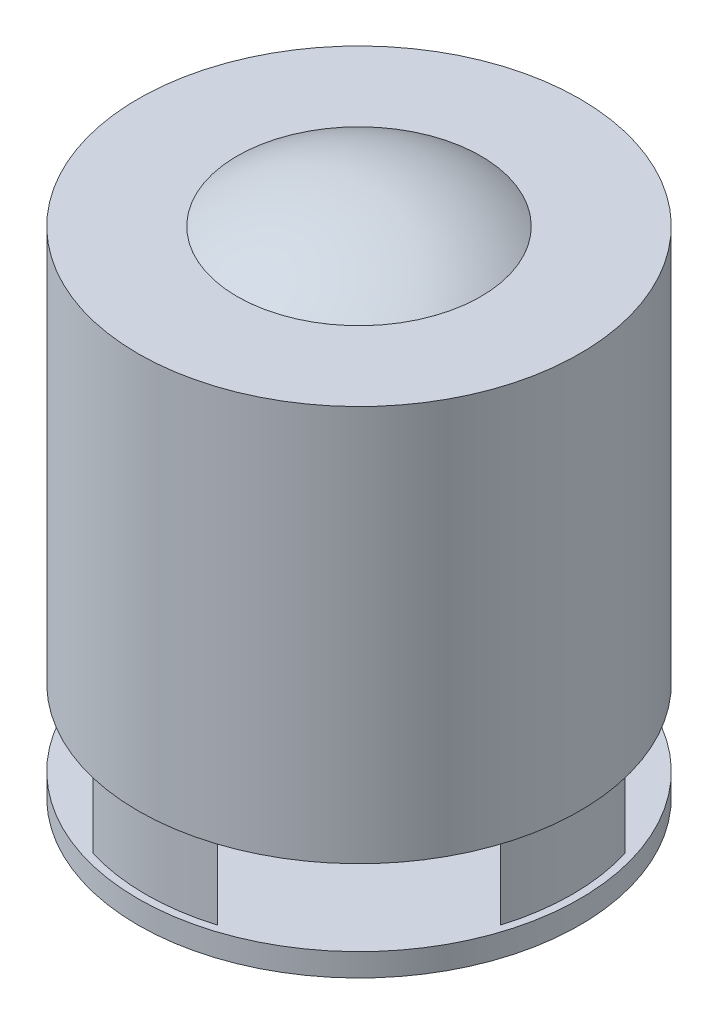
ISO-10303-21;
HEADER;
FILE_DESCRIPTION(('STEP AP214'),'2;1');
FILE_NAME('part.step','',(''),(''),'','','');
FILE_SCHEMA(('AUTOMOTIVE_DESIGN { 1 0 10303 214 1 1 1 1 }'));
ENDSEC;
DATA;
#1=APPLICATION_CONTEXT('core data for automotive mechanical design processes');
#2=APPLICATION_PROTOCOL_DEFINITION('international standard','automotive_design',2000,#1);
#3=PRODUCT_CONTEXT('',#1,'mechanical');
#4=PRODUCT('Part','Part','',(#3));
#5=PRODUCT_RELATED_PRODUCT_CATEGORY('part','',(#4));
#6=PRODUCT_DEFINITION_FORMATION('','',#4);
#7=PRODUCT_DEFINITION_CONTEXT('part definition',#1,'design');
#8=PRODUCT_DEFINITION('design','',#6,#7);
#9=PRODUCT_DEFINITION_SHAPE('','',#8);
#10=(LENGTH_UNIT() NAMED_UNIT(*) SI_UNIT(.MILLI.,.METRE.));
#11=(NAMED_UNIT(*) PLANE_ANGLE_UNIT() SI_UNIT($,.RADIAN.));
#12=(NAMED_UNIT(*) SI_UNIT($,.STERADIAN.) SOLID_ANGLE_UNIT());
#13=UNCERTAINTY_MEASURE_WITH_UNIT(LENGTH_MEASURE(1.E-05),#10,'distance_accuracy_value','');
#14=(GEOMETRIC_REPRESENTATION_CONTEXT(3) GLOBAL_UNCERTAINTY_ASSIGNED_CONTEXT((#13)) GLOBAL_UNIT_ASSIGNED_CONTEXT((#10,
#11,#12)) REPRESENTATION_CONTEXT('',''));
#15=CARTESIAN_POINT('',(0.,0.,0.));
#16=DIRECTION('',(0.,0.,1.));
#17=DIRECTION('',(1.,0.,0.));
#18=AXIS2_PLACEMENT_3D('',#15,#16,#17);
#19=CARTESIAN_POINT('',(0.,0.,0.));
#20=DIRECTION('',(0.,1.,0.));
#21=DIRECTION('',(0.,0.,1.));
#22=AXIS2_PLACEMENT_3D('',#19,#20,#21);
#23=PLANE('',#22);
#24=DIRECTION('',(-0.852221843279124,0.,-0.52318059008141));
#25=VECTOR('',#24,1.);
#26=CARTESIAN_POINT('',(-6.00000000000018,0.,-25.4355));
#27=LINE('',#26,#25);
#28=CARTESIAN_POINT('',(-6.00000000000018,0.,-25.4355));
#29=VERTEX_POINT('',#28);
#30=CARTESIAN_POINT('',(-8.18680124985441,0.,-26.7779813941489));
#31=VERTEX_POINT('',#30);
#32=EDGE_CURVE('E188',#29,#31,#27,.T.);
#33=ORIENTED_EDGE('',*,*,#32,.F.);
#34=DIRECTION('',(-1.,0.,0.));
#35=VECTOR('',#34,1.);
#36=CARTESIAN_POINT('',(5.99999999999982,0.,-25.4355));
#37=LINE('',#36,#35);
#38=CARTESIAN_POINT('',(5.99999999999982,0.,-25.4355));
#39=VERTEX_POINT('',#38);
#40=EDGE_CURVE('E193',#39,#29,#37,.T.);
#41=ORIENTED_EDGE('',*,*,#40,.F.);
#42=DIRECTION('',(-0.852221843279117,0.,0.523180590081421));
#43=VECTOR('',#42,1.);
#44=CARTESIAN_POINT('',(5.99999999999982,0.,-25.4355));
#45=LINE('',#44,#43);
#46=CARTESIAN_POINT('',(8.18680124985403,0.,-26.777981394149));
#47=VERTEX_POINT('',#46);
#48=EDGE_CURVE('E208',#47,#39,#45,.T.);
#49=ORIENTED_EDGE('',*,*,#48,.F.);
#50=CARTESIAN_POINT('',(0.,0.,0.));
#51=DIRECTION('',(0.,-1.,0.));
#52=DIRECTION('',(0.,0.,-1.));
#53=AXIS2_PLACEMENT_3D('',#50,#51,#52);
#54=CIRCLE('',#53,28.0015);
#55=EDGE_CURVE('E205',#31,#47,#54,.T.);
#56=ORIENTED_EDGE('',*,*,#55,.F.);
#57=EDGE_LOOP('',(#33,#41,#49,#56));
#58=FACE_BOUND('',#57,.T.);
#59=DIRECTION('',(0.523180590081413,0.,-0.852221843279122));
#60=VECTOR('',#59,1.);
#61=CARTESIAN_POINT('',(25.4355,0.,-6.00000000000009));
#62=LINE('',#61,#60);
#63=CARTESIAN_POINT('',(25.4355,0.,-6.00000000000009));
#64=VERTEX_POINT('',#63);
#65=CARTESIAN_POINT('',(26.7779813941489,0.,-8.18680124985432));
#66=VERTEX_POINT('',#65);
#67=EDGE_CURVE('E260',#64,#66,#62,.T.);
#68=ORIENTED_EDGE('',*,*,#67,.F.);
#69=DIRECTION('',(0.,0.,-1.));
#70=VECTOR('',#69,1.);
#71=CARTESIAN_POINT('',(25.4355,0.,5.99999999999991));
#72=LINE('',#71,#70);
#73=CARTESIAN_POINT('',(25.4355,0.,5.99999999999991));
#74=VERTEX_POINT('',#73);
#75=EDGE_CURVE('E265',#74,#64,#72,.T.);
#76=ORIENTED_EDGE('',*,*,#75,.F.);
#77=DIRECTION('',(-0.523180590081419,0.,-0.852221843279118));
#78=VECTOR('',#77,1.);
#79=CARTESIAN_POINT('',(25.4355,0.,5.99999999999991));
#80=LINE('',#79,#78);
#81=CARTESIAN_POINT('',(26.7779813941489,0.,8.18680124985413));
#82=VERTEX_POINT('',#81);
#83=EDGE_CURVE('E280',#82,#74,#80,.T.);
#84=ORIENTED_EDGE('',*,*,#83,.F.);
#85=CARTESIAN_POINT('',(0.,0.,0.));
#86=DIRECTION('',(0.,-1.,0.));
#87=DIRECTION('',(0.,0.,-1.));
#88=AXIS2_PLACEMENT_3D('',#85,#86,#87);
#89=CIRCLE('',#88,28.0015);
#90=EDGE_CURVE('E277',#66,#82,#89,.T.);
#91=ORIENTED_EDGE('',*,*,#90,.F.);
#92=EDGE_LOOP('',(#68,#76,#84,#91));
#93=FACE_BOUND('',#92,.T.);
#94=CARTESIAN_POINT('',(0.,0.,0.));
#95=DIRECTION('',(0.,1.,0.));
#96=DIRECTION('',(0.,0.,1.));
#97=AXIS2_PLACEMENT_3D('',#94,#95,#96);
#98=CIRCLE('',#97,29.);
#99=CARTESIAN_POINT('',(0.,0.,-29.));
#100=VERTEX_POINT('',#99);
#101=EDGE_CURVE('E296',#100,#100,#98,.T.);
#102=ORIENTED_EDGE('',*,*,#101,.F.);
#103=EDGE_LOOP('',(#102));
#104=FACE_BOUND('',#103,.T.);
#105=DIRECTION('',(0.85222184327912,0.,0.523180590081416));
#106=VECTOR('',#105,1.);
#107=CARTESIAN_POINT('',(6.,0.,25.4355));
#108=LINE('',#107,#106);
#109=CARTESIAN_POINT('',(6.,0.,25.4355));
#110=VERTEX_POINT('',#109);
#111=CARTESIAN_POINT('',(8.18680124985422,0.,26.7779813941489));
#112=VERTEX_POINT('',#111);
#113=EDGE_CURVE('E224',#110,#112,#108,.T.);
#114=ORIENTED_EDGE('',*,*,#113,.F.);
#115=DIRECTION('',(1.,0.,0.));
#116=VECTOR('',#115,1.);
#117=CARTESIAN_POINT('',(-6.,0.,25.4355));
#118=LINE('',#117,#116);
#119=CARTESIAN_POINT('',(-6.,0.,25.4355));
#120=VERTEX_POINT('',#119);
#121=EDGE_CURVE('E229',#120,#110,#118,.T.);
#122=ORIENTED_EDGE('',*,*,#121,.F.);
#123=DIRECTION('',(0.85222184327912,0.,-0.523180590081416));
#124=VECTOR('',#123,1.);
#125=CARTESIAN_POINT('',(-6.,0.,25.4355));
#126=LINE('',#125,#124);
#127=CARTESIAN_POINT('',(-8.18680124985423,0.,26.7779813941489));
#128=VERTEX_POINT('',#127);
#129=EDGE_CURVE('E244',#128,#120,#126,.T.);
#130=ORIENTED_EDGE('',*,*,#129,.F.);
#131=CARTESIAN_POINT('',(0.,0.,0.));
#132=DIRECTION('',(0.,-1.,0.));
#133=DIRECTION('',(0.,0.,-1.));
#134=AXIS2_PLACEMENT_3D('',#131,#132,#133);
#135=CIRCLE('',#134,28.0015);
#136=EDGE_CURVE('E241',#112,#128,#135,.T.);
#137=ORIENTED_EDGE('',*,*,#136,.F.);
#138=EDGE_LOOP('',(#114,#122,#130,#137));
#139=FACE_BOUND('',#138,.T.);
#140=DIRECTION('',(-0.523180590081406,0.,0.852221843279126));
#141=VECTOR('',#140,1.);
#142=CARTESIAN_POINT('',(-25.4354999999999,0.,6.00000000000026));
#143=LINE('',#142,#141);
#144=CARTESIAN_POINT('',(-25.4354999999999,0.,6.00000000000026));
#145=VERTEX_POINT('',#144);
#146=CARTESIAN_POINT('',(-26.7779813941488,0.,8.18680124985451));
#147=VERTEX_POINT('',#146);
#148=EDGE_CURVE('E177',#145,#147,#143,.T.);
#149=ORIENTED_EDGE('',*,*,#148,.F.);
#150=DIRECTION('',(0.,0.,1.));
#151=VECTOR('',#150,1.);
#152=CARTESIAN_POINT('',(-25.4355000000001,0.,-5.99999999999974));
#153=LINE('',#152,#151);
#154=CARTESIAN_POINT('',(-25.4355000000001,0.,-5.99999999999974));
#155=VERTEX_POINT('',#154);
#156=EDGE_CURVE('E158',#155,#145,#153,.T.);
#157=ORIENTED_EDGE('',*,*,#156,.F.);
#158=DIRECTION('',(0.523180590081425,0.,0.852221843279115));
#159=VECTOR('',#158,1.);
#160=CARTESIAN_POINT('',(-25.4355000000001,0.,-5.99999999999974));
#161=LINE('',#160,#159);
#162=CARTESIAN_POINT('',(-26.777981394149,0.,-8.18680124985394));
#163=VERTEX_POINT('',#162);
#164=EDGE_CURVE('E56',#163,#155,#161,.T.);
#165=ORIENTED_EDGE('',*,*,#164,.F.);
#166=CARTESIAN_POINT('',(0.,0.,0.));
#167=DIRECTION('',(0.,-1.,0.));
#168=DIRECTION('',(0.,0.,-1.));
#169=AXIS2_PLACEMENT_3D('',#166,#167,#168);
#170=CIRCLE('',#169,28.0015);
#171=EDGE_CURVE('E51',#147,#163,#170,.T.);
#172=ORIENTED_EDGE('',*,*,#171,.F.);
#173=EDGE_LOOP('',(#149,#157,#165,#172));
#174=FACE_BOUND('',#173,.T.);
#175=ADVANCED_FACE('F34',(#58,#93,#104,#139,#174),#23,.F.);
#176=CARTESIAN_POINT('',(0.,52.,0.));
#177=DIRECTION('',(0.,-1.,0.));
#178=DIRECTION('',(0.,0.,-1.));
#179=AXIS2_PLACEMENT_3D('',#176,#177,#178);
#180=CYLINDRICAL_SURFACE('',#179,29.);
#181=CARTESIAN_POINT('',(0.,52.,0.));
#182=DIRECTION('',(0.,1.,0.));
#183=DIRECTION('',(0.,0.,1.));
#184=AXIS2_PLACEMENT_3D('',#181,#182,#183);
#185=CIRCLE('',#184,29.);
#186=CARTESIAN_POINT('',(0.,52.,-29.));
#187=VERTEX_POINT('',#186);
#188=EDGE_CURVE('E43',#187,#187,#185,.T.);
#189=CARTESIAN_POINT('',(0.,52.,-29.));
#190=CARTESIAN_POINT('',(0.,51.4583333333333,-29.));
#191=CARTESIAN_POINT('',(0.,50.9166666666667,-29.));
#192=CARTESIAN_POINT('',(0.,49.8333333333333,-29.));
#193=CARTESIAN_POINT('',(0.,49.2916666666667,-29.));
#194=CARTESIAN_POINT('',(0.,48.2083333333333,-29.));
#195=CARTESIAN_POINT('',(0.,47.6666666666667,-29.));
#196=CARTESIAN_POINT('',(0.,46.5833333333333,-29.));
#197=CARTESIAN_POINT('',(0.,46.0416666666667,-29.));
#198=CARTESIAN_POINT('',(0.,44.9583333333333,-29.));
#199=CARTESIAN_POINT('',(0.,44.4166666666667,-29.));
#200=CARTESIAN_POINT('',(0.,43.3333333333333,-29.));
#201=CARTESIAN_POINT('',(0.,42.7916666666667,-29.));
#202=CARTESIAN_POINT('',(0.,41.7083333333333,-29.));
#203=CARTESIAN_POINT('',(0.,41.1666666666667,-29.));
#204=CARTESIAN_POINT('',(0.,40.0833333333333,-29.));
#205=CARTESIAN_POINT('',(0.,39.5416666666667,-29.));
#206=CARTESIAN_POINT('',(0.,38.4583333333333,-29.));
#207=CARTESIAN_POINT('',(0.,37.9166666666667,-29.));
#208=CARTESIAN_POINT('',(0.,36.8333333333333,-29.));
#209=CARTESIAN_POINT('',(0.,36.2916666666667,-29.));
#210=CARTESIAN_POINT('',(0.,35.2083333333333,-29.));
#211=CARTESIAN_POINT('',(0.,34.6666666666667,-29.));
#212=CARTESIAN_POINT('',(0.,33.5833333333333,-29.));
#213=CARTESIAN_POINT('',(0.,33.0416666666667,-29.));
#214=CARTESIAN_POINT('',(0.,31.9583333333333,-29.));
#215=CARTESIAN_POINT('',(0.,31.4166666666667,-29.));
#216=CARTESIAN_POINT('',(0.,30.3333333333333,-29.));
#217=CARTESIAN_POINT('',(0.,29.7916666666667,-29.));
#218=CARTESIAN_POINT('',(0.,28.7083333333333,-29.));
#219=CARTESIAN_POINT('',(0.,28.1666666666667,-29.));
#220=CARTESIAN_POINT('',(0.,27.0833333333333,-29.));
#221=CARTESIAN_POINT('',(0.,26.5416666666667,-29.));
#222=CARTESIAN_POINT('',(0.,25.4583333333333,-29.));
#223=CARTESIAN_POINT('',(0.,24.9166666666667,-29.));
#224=CARTESIAN_POINT('',(0.,23.8333333333333,-29.));
#225=CARTESIAN_POINT('',(0.,23.2916666666667,-29.));
#226=CARTESIAN_POINT('',(0.,22.2083333333333,-29.));
#227=CARTESIAN_POINT('',(0.,21.6666666666667,-29.));
#228=CARTESIAN_POINT('',(0.,20.5833333333333,-29.));
#229=CARTESIAN_POINT('',(0.,20.0416666666667,-29.));
#230=CARTESIAN_POINT('',(0.,18.9583333333333,-29.));
#231=CARTESIAN_POINT('',(0.,18.4166666666667,-29.));
#232=CARTESIAN_POINT('',(0.,17.3333333333333,-29.));
#233=CARTESIAN_POINT('',(0.,16.7916666666667,-29.));
#234=CARTESIAN_POINT('',(0.,15.7083333333333,-29.));
#235=CARTESIAN_POINT('',(0.,15.1666666666667,-29.));
#236=CARTESIAN_POINT('',(0.,14.0833333333333,-29.));
#237=CARTESIAN_POINT('',(0.,13.5416666666667,-29.));
#238=CARTESIAN_POINT('',(0.,12.4583333333333,-29.));
#239=CARTESIAN_POINT('',(0.,11.9166666666667,-29.));
#240=CARTESIAN_POINT('',(0.,10.8333333333333,-29.));
#241=CARTESIAN_POINT('',(0.,10.2916666666667,-29.));
#242=CARTESIAN_POINT('',(0.,9.20833333333333,-29.));
#243=CARTESIAN_POINT('',(0.,8.66666666666667,-29.));
#244=CARTESIAN_POINT('',(0.,7.58333333333333,-29.));
#245=CARTESIAN_POINT('',(0.,7.04166666666667,-29.));
#246=CARTESIAN_POINT('',(0.,5.95833333333333,-29.));
#247=CARTESIAN_POINT('',(0.,5.41666666666667,-29.));
#248=CARTESIAN_POINT('',(0.,4.33333333333333,-29.));
#249=CARTESIAN_POINT('',(0.,3.79166666666667,-29.));
#250=CARTESIAN_POINT('',(0.,2.70833333333334,-29.));
#251=CARTESIAN_POINT('',(0.,2.16666666666667,-29.));
#252=CARTESIAN_POINT('',(0.,1.08333333333333,-29.));
#253=CARTESIAN_POINT('',(0.,0.541666666666667,-29.));
#254=CARTESIAN_POINT('',(0.,0.,-29.));
#255=B_SPLINE_CURVE_WITH_KNOTS('',3,(#189,#190,#191,#192,#193,#194,#195,#196,#197,#198,#199,
#200,#201,#202,#203,#204,#205,#206,#207,#208,#209,#210,#211,#212,#213,#214,#215,#216,#217,#218,
#219,#220,#221,#222,#223,#224,#225,#226,#227,#228,#229,#230,#231,#232,#233,#234,#235,#236,#237,
#238,#239,#240,#241,#242,#243,#244,#245,#246,#247,#248,#249,#250,#251,#252,#253,#254),
.UNSPECIFIED.,.F.,.F.,(4,2,2,2,2,2,2,2,2,2,2,2,2,2,2,2,2,2,2,2,2,2,2,2,2,2,2,2,2,2,2,2,4),(0.,
1.62499999999999,3.25,4.875,6.49999999999999,8.12499999999999,9.74999999999999,11.375,13.,
14.625,16.25,17.875,19.5,21.125,22.75,24.375,26.,27.625,29.25,30.875,32.5,34.125,35.75,37.375,
39.,40.625,42.25,43.875,45.5,47.125,48.75,50.375,52.),.UNSPECIFIED.);
#256=EDGE_CURVE('BSEAM301',#187,#100,#255,.T.);
#257=ORIENTED_EDGE('',*,*,#188,.F.);
#258=ORIENTED_EDGE('',*,*,#101,.T.);
#259=ORIENTED_EDGE('',*,*,#256,.T.);
#260=ORIENTED_EDGE('',*,*,#256,.F.);
#261=EDGE_LOOP('',(#257,#259,#258,#260));
#262=FACE_BOUND('',#261,.T.);
#263=ADVANCED_FACE('F301',(#262),#180,.T.);
#264=CARTESIAN_POINT('',(0.,52.,0.));
#265=DIRECTION('',(0.,1.,0.));
#266=DIRECTION('',(0.,0.,1.));
#267=AXIS2_PLACEMENT_3D('',#264,#265,#266);
#268=PLANE('',#267);
#269=CARTESIAN_POINT('',(0.,52.,0.));
#270=DIRECTION('',(0.,1.,0.));
#271=DIRECTION('',(0.,0.,1.));
#272=AXIS2_PLACEMENT_3D('',#269,#270,#271);
#273=CIRCLE('',#272,16.);
#274=CARTESIAN_POINT('',(0.,52.,16.));
#275=VERTEX_POINT('',#274);
#276=EDGE_CURVE('E11',#275,#275,#273,.T.);
#277=ORIENTED_EDGE('',*,*,#276,.F.);
#278=EDGE_LOOP('',(#277));
#279=FACE_BOUND('',#278,.T.);
#280=ORIENTED_EDGE('',*,*,#188,.T.);
#281=EDGE_LOOP('',(#280));
#282=FACE_BOUND('',#281,.T.);
#283=ADVANCED_FACE('F347',(#279,#282),#268,.T.);
#284=CARTESIAN_POINT('',(25.4355,-10.,-6.00000000000009));
#285=DIRECTION('',(0.852221843279122,0.,0.523180590081413));
#286=DIRECTION('',(0.523180590081413,0.,-0.852221843279122));
#287=AXIS2_PLACEMENT_3D('',#284,#285,#286);
#288=PLANE('',#287);
#289=ORIENTED_EDGE('',*,*,#67,.T.);
#290=DIRECTION('',(0.,1.,0.));
#291=VECTOR('',#290,1.);
#292=CARTESIAN_POINT('',(26.7779813941489,-10.,-8.18680124985432));
#293=LINE('',#292,#291);
#294=CARTESIAN_POINT('',(26.7779813941489,-10.,-8.18680124985432));
#295=VERTEX_POINT('',#294);
#296=EDGE_CURVE('E293',#295,#66,#293,.T.);
#297=ORIENTED_EDGE('',*,*,#296,.F.);
#298=DIRECTION('',(0.523180590081413,0.,-0.852221843279122));
#299=VECTOR('',#298,1.);
#300=CARTESIAN_POINT('',(25.4355,-10.,-6.00000000000009));
#301=LINE('',#300,#299);
#302=CARTESIAN_POINT('',(25.4355,-10.,-6.00000000000009));
#303=VERTEX_POINT('',#302);
#304=EDGE_CURVE('E261',#303,#295,#301,.T.);
#305=ORIENTED_EDGE('',*,*,#304,.F.);
#306=DIRECTION('',(0.,1.,0.));
#307=VECTOR('',#306,1.);
#308=CARTESIAN_POINT('',(25.4355,-10.,-6.00000000000009));
#309=LINE('',#308,#307);
#310=EDGE_CURVE('E274',#303,#64,#309,.T.);
#311=ORIENTED_EDGE('',*,*,#310,.T.);
#312=EDGE_LOOP('',(#289,#297,#305,#311));
#313=FACE_BOUND('',#312,.T.);
#314=ADVANCED_FACE('F350',(#313),#288,.F.);
#315=CARTESIAN_POINT('',(0.,-10.,0.));
#316=DIRECTION('',(0.,1.,0.));
#317=DIRECTION('',(0.,0.,1.));
#318=AXIS2_PLACEMENT_3D('',#315,#316,#317);
#319=CYLINDRICAL_SURFACE('',#318,28.0015);
#320=ORIENTED_EDGE('',*,*,#90,.T.);
#321=DIRECTION('',(0.,1.,0.));
#322=VECTOR('',#321,1.);
#323=CARTESIAN_POINT('',(26.7779813941489,-10.,8.18680124985413));
#324=LINE('',#323,#322);
#325=CARTESIAN_POINT('',(26.7779813941489,-10.,8.18680124985413));
#326=VERTEX_POINT('',#325);
#327=EDGE_CURVE('E290',#326,#82,#324,.T.);
#328=ORIENTED_EDGE('',*,*,#327,.F.);
#329=CARTESIAN_POINT('',(0.,-10.,0.));
#330=DIRECTION('',(0.,-1.,0.));
#331=DIRECTION('',(0.,0.,-1.));
#332=AXIS2_PLACEMENT_3D('',#329,#330,#331);
#333=CIRCLE('',#332,28.0015);
#334=EDGE_CURVE('E264',#295,#326,#333,.T.);
#335=ORIENTED_EDGE('',*,*,#334,.F.);
#336=ORIENTED_EDGE('',*,*,#296,.T.);
#337=EDGE_LOOP('',(#320,#328,#335,#336));
#338=FACE_BOUND('',#337,.T.);
#339=ADVANCED_FACE('F360',(#338),#319,.T.);
#340=CARTESIAN_POINT('',(25.4355,-10.,5.99999999999991));
#341=DIRECTION('',(0.852221843279118,0.,-0.523180590081419));
#342=DIRECTION('',(-0.523180590081419,0.,-0.852221843279119));
#343=AXIS2_PLACEMENT_3D('',#340,#341,#342);
#344=PLANE('',#343);
#345=ORIENTED_EDGE('',*,*,#83,.T.);
#346=DIRECTION('',(0.,1.,0.));
#347=VECTOR('',#346,1.);
#348=CARTESIAN_POINT('',(25.4355,-10.,5.99999999999991));
#349=LINE('',#348,#347);
#350=CARTESIAN_POINT('',(25.4355,-10.,5.99999999999991));
#351=VERTEX_POINT('',#350);
#352=EDGE_CURVE('E287',#351,#74,#349,.T.);
#353=ORIENTED_EDGE('',*,*,#352,.F.);
#354=DIRECTION('',(-0.523180590081419,0.,-0.852221843279118));
#355=VECTOR('',#354,1.);
#356=CARTESIAN_POINT('',(25.4355,-10.,5.99999999999991));
#357=LINE('',#356,#355);
#358=EDGE_CURVE('E268',#326,#351,#357,.T.);
#359=ORIENTED_EDGE('',*,*,#358,.F.);
#360=ORIENTED_EDGE('',*,*,#327,.T.);
#361=EDGE_LOOP('',(#345,#353,#359,#360));
#362=FACE_BOUND('',#361,.T.);
#363=ADVANCED_FACE('F364',(#362),#344,.F.);
#364=CARTESIAN_POINT('',(25.4355,-10.,5.99999999999991));
#365=DIRECTION('',(1.,0.,0.));
#366=DIRECTION('',(0.,0.,-1.));
#367=AXIS2_PLACEMENT_3D('',#364,#365,#366);
#368=PLANE('',#367);
#369=ORIENTED_EDGE('',*,*,#75,.T.);
#370=ORIENTED_EDGE('',*,*,#310,.F.);
#371=DIRECTION('',(0.,0.,-1.));
#372=VECTOR('',#371,1.);
#373=CARTESIAN_POINT('',(25.4355,-10.,5.99999999999991));
#374=LINE('',#373,#372);
#375=EDGE_CURVE('E271',#351,#303,#374,.T.);
#376=ORIENTED_EDGE('',*,*,#375,.F.);
#377=ORIENTED_EDGE('',*,*,#352,.T.);
#378=EDGE_LOOP('',(#369,#370,#376,#377));
#379=FACE_BOUND('',#378,.T.);
#380=ADVANCED_FACE('F368',(#379),#368,.F.);
#381=CARTESIAN_POINT('',(6.,-10.,25.4355));
#382=DIRECTION('',(-0.523180590081416,0.,0.85222184327912));
#383=DIRECTION('',(0.85222184327912,0.,0.523180590081416));
#384=AXIS2_PLACEMENT_3D('',#381,#382,#383);
#385=PLANE('',#384);
#386=ORIENTED_EDGE('',*,*,#113,.T.);
#387=DIRECTION('',(0.,1.,0.));
#388=VECTOR('',#387,1.);
#389=CARTESIAN_POINT('',(8.18680124985422,-10.,26.7779813941489));
#390=LINE('',#389,#388);
#391=CARTESIAN_POINT('',(8.18680124985422,-10.,26.7779813941489));
#392=VERTEX_POINT('',#391);
#393=EDGE_CURVE('E257',#392,#112,#390,.T.);
#394=ORIENTED_EDGE('',*,*,#393,.F.);
#395=DIRECTION('',(0.85222184327912,0.,0.523180590081416));
#396=VECTOR('',#395,1.);
#397=CARTESIAN_POINT('',(6.,-10.,25.4355));
#398=LINE('',#397,#396);
#399=CARTESIAN_POINT('',(6.,-10.,25.4355));
#400=VERTEX_POINT('',#399);
#401=EDGE_CURVE('E225',#400,#392,#398,.T.);
#402=ORIENTED_EDGE('',*,*,#401,.F.);
#403=DIRECTION('',(0.,1.,0.));
#404=VECTOR('',#403,1.);
#405=CARTESIAN_POINT('',(6.,-10.,25.4355));
#406=LINE('',#405,#404);
#407=EDGE_CURVE('E238',#400,#110,#406,.T.);
#408=ORIENTED_EDGE('',*,*,#407,.T.);
#409=EDGE_LOOP('',(#386,#394,#402,#408));
#410=FACE_BOUND('',#409,.T.);
#411=ADVANCED_FACE('F372',(#410),#385,.F.);
#412=CARTESIAN_POINT('',(0.,-10.,0.));
#413=DIRECTION('',(0.,1.,0.));
#414=DIRECTION('',(0.,0.,1.));
#415=AXIS2_PLACEMENT_3D('',#412,#413,#414);
#416=CYLINDRICAL_SURFACE('',#415,28.0015);
#417=ORIENTED_EDGE('',*,*,#136,.T.);
#418=DIRECTION('',(0.,1.,0.));
#419=VECTOR('',#418,1.);
#420=CARTESIAN_POINT('',(-8.18680124985423,-10.,26.7779813941489));
#421=LINE('',#420,#419);
#422=CARTESIAN_POINT('',(-8.18680124985423,-10.,26.7779813941489));
#423=VERTEX_POINT('',#422);
#424=EDGE_CURVE('E254',#423,#128,#421,.T.);
#425=ORIENTED_EDGE('',*,*,#424,.F.);
#426=CARTESIAN_POINT('',(0.,-10.,0.));
#427=DIRECTION('',(0.,-1.,0.));
#428=DIRECTION('',(0.,0.,-1.));
#429=AXIS2_PLACEMENT_3D('',#426,#427,#428);
#430=CIRCLE('',#429,28.0015);
#431=EDGE_CURVE('E228',#392,#423,#430,.T.);
#432=ORIENTED_EDGE('',*,*,#431,.F.);
#433=ORIENTED_EDGE('',*,*,#393,.T.);
#434=EDGE_LOOP('',(#417,#425,#432,#433));
#435=FACE_BOUND('',#434,.T.);
#436=ADVANCED_FACE('F376',(#435),#416,.T.);
#437=CARTESIAN_POINT('',(-6.,-10.,25.4355));
#438=DIRECTION('',(0.523180590081416,0.,0.85222184327912));
#439=DIRECTION('',(0.85222184327912,0.,-0.523180590081416));
#440=AXIS2_PLACEMENT_3D('',#437,#438,#439);
#441=PLANE('',#440);
#442=ORIENTED_EDGE('',*,*,#129,.T.);
#443=DIRECTION('',(0.,1.,0.));
#444=VECTOR('',#443,1.);
#445=CARTESIAN_POINT('',(-6.,-10.,25.4355));
#446=LINE('',#445,#444);
#447=CARTESIAN_POINT('',(-6.,-10.,25.4355));
#448=VERTEX_POINT('',#447);
#449=EDGE_CURVE('E251',#448,#120,#446,.T.);
#450=ORIENTED_EDGE('',*,*,#449,.F.);
#451=DIRECTION('',(0.85222184327912,0.,-0.523180590081416));
#452=VECTOR('',#451,1.);
#453=CARTESIAN_POINT('',(-6.,-10.,25.4355));
#454=LINE('',#453,#452);
#455=EDGE_CURVE('E232',#423,#448,#454,.T.);
#456=ORIENTED_EDGE('',*,*,#455,.F.);
#457=ORIENTED_EDGE('',*,*,#424,.T.);
#458=EDGE_LOOP('',(#442,#450,#456,#457));
#459=FACE_BOUND('',#458,.T.);
#460=ADVANCED_FACE('F380',(#459),#441,.F.);
#461=CARTESIAN_POINT('',(-6.,-10.,25.4355));
#462=DIRECTION('',(0.,0.,1.));
#463=DIRECTION('',(1.,0.,0.));
#464=AXIS2_PLACEMENT_3D('',#461,#462,#463);
#465=PLANE('',#464);
#466=ORIENTED_EDGE('',*,*,#121,.T.);
#467=ORIENTED_EDGE('',*,*,#407,.F.);
#468=DIRECTION('',(1.,0.,0.));
#469=VECTOR('',#468,1.);
#470=CARTESIAN_POINT('',(-6.,-10.,25.4355));
#471=LINE('',#470,#469);
#472=EDGE_CURVE('E235',#448,#400,#471,.T.);
#473=ORIENTED_EDGE('',*,*,#472,.F.);
#474=ORIENTED_EDGE('',*,*,#449,.T.);
#475=EDGE_LOOP('',(#466,#467,#473,#474));
#476=FACE_BOUND('',#475,.T.);
#477=ADVANCED_FACE('F384',(#476),#465,.F.);
#478=CARTESIAN_POINT('',(-6.00000000000018,-10.,-25.4355));
#479=DIRECTION('',(0.52318059008141,0.,-0.852221843279124));
#480=DIRECTION('',(-0.852221843279124,0.,-0.52318059008141));
#481=AXIS2_PLACEMENT_3D('',#478,#479,#480);
#482=PLANE('',#481);
#483=ORIENTED_EDGE('',*,*,#32,.T.);
#484=DIRECTION('',(0.,1.,0.));
#485=VECTOR('',#484,1.);
#486=CARTESIAN_POINT('',(-8.18680124985441,-10.,-26.7779813941489));
#487=LINE('',#486,#485);
#488=CARTESIAN_POINT('',(-8.18680124985441,-10.,-26.7779813941489));
#489=VERTEX_POINT('',#488);
#490=EDGE_CURVE('E221',#489,#31,#487,.T.);
#491=ORIENTED_EDGE('',*,*,#490,.F.);
#492=DIRECTION('',(-0.852221843279124,0.,-0.52318059008141));
#493=VECTOR('',#492,1.);
#494=CARTESIAN_POINT('',(-6.00000000000018,-10.,-25.4355));
#495=LINE('',#494,#493);
#496=CARTESIAN_POINT('',(-6.00000000000018,-10.,-25.4355));
#497=VERTEX_POINT('',#496);
#498=EDGE_CURVE('E189',#497,#489,#495,.T.);
#499=ORIENTED_EDGE('',*,*,#498,.F.);
#500=DIRECTION('',(0.,1.,0.));
#501=VECTOR('',#500,1.);
#502=CARTESIAN_POINT('',(-6.00000000000018,-10.,-25.4355));
#503=LINE('',#502,#501);
#504=EDGE_CURVE('E202',#497,#29,#503,.T.);
#505=ORIENTED_EDGE('',*,*,#504,.T.);
#506=EDGE_LOOP('',(#483,#491,#499,#505));
#507=FACE_BOUND('',#506,.T.);
#508=ADVANCED_FACE('F388',(#507),#482,.F.);
#509=CARTESIAN_POINT('',(0.,-10.,0.));
#510=DIRECTION('',(0.,1.,0.));
#511=DIRECTION('',(0.,0.,1.));
#512=AXIS2_PLACEMENT_3D('',#509,#510,#511);
#513=CYLINDRICAL_SURFACE('',#512,28.0015);
#514=ORIENTED_EDGE('',*,*,#55,.T.);
#515=DIRECTION('',(0.,1.,0.));
#516=VECTOR('',#515,1.);
#517=CARTESIAN_POINT('',(8.18680124985404,-10.,-26.777981394149));
#518=LINE('',#517,#516);
#519=CARTESIAN_POINT('',(8.18680124985404,-10.,-26.777981394149));
#520=VERTEX_POINT('',#519);
#521=EDGE_CURVE('E218',#520,#47,#518,.T.);
#522=ORIENTED_EDGE('',*,*,#521,.F.);
#523=CARTESIAN_POINT('',(0.,-10.,0.));
#524=DIRECTION('',(0.,-1.,0.));
#525=DIRECTION('',(0.,0.,-1.));
#526=AXIS2_PLACEMENT_3D('',#523,#524,#525);
#527=CIRCLE('',#526,28.0015);
#528=EDGE_CURVE('E192',#489,#520,#527,.T.);
#529=ORIENTED_EDGE('',*,*,#528,.F.);
#530=ORIENTED_EDGE('',*,*,#490,.T.);
#531=EDGE_LOOP('',(#514,#522,#529,#530));
#532=FACE_BOUND('',#531,.T.);
#533=ADVANCED_FACE('F392',(#532),#513,.T.);
#534=CARTESIAN_POINT('',(5.99999999999982,-10.,-25.4355));
#535=DIRECTION('',(-0.523180590081422,0.,-0.852221843279117));
#536=DIRECTION('',(-0.852221843279117,0.,0.523180590081422));
#537=AXIS2_PLACEMENT_3D('',#534,#535,#536);
#538=PLANE('',#537);
#539=ORIENTED_EDGE('',*,*,#48,.T.);
#540=DIRECTION('',(0.,1.,0.));
#541=VECTOR('',#540,1.);
#542=CARTESIAN_POINT('',(5.99999999999982,-10.,-25.4355));
#543=LINE('',#542,#541);
#544=CARTESIAN_POINT('',(5.99999999999982,-10.,-25.4355));
#545=VERTEX_POINT('',#544);
#546=EDGE_CURVE('E215',#545,#39,#543,.T.);
#547=ORIENTED_EDGE('',*,*,#546,.F.);
#548=DIRECTION('',(-0.852221843279117,0.,0.523180590081421));
#549=VECTOR('',#548,1.);
#550=CARTESIAN_POINT('',(5.99999999999982,-10.,-25.4355));
#551=LINE('',#550,#549);
#552=EDGE_CURVE('E196',#520,#545,#551,.T.);
#553=ORIENTED_EDGE('',*,*,#552,.F.);
#554=ORIENTED_EDGE('',*,*,#521,.T.);
#555=EDGE_LOOP('',(#539,#547,#553,#554));
#556=FACE_BOUND('',#555,.T.);
#557=ADVANCED_FACE('F396',(#556),#538,.F.);
#558=CARTESIAN_POINT('',(5.99999999999982,-10.,-25.4355));
#559=DIRECTION('',(0.,0.,-1.));
#560=DIRECTION('',(-1.,0.,0.));
#561=AXIS2_PLACEMENT_3D('',#558,#559,#560);
#562=PLANE('',#561);
#563=ORIENTED_EDGE('',*,*,#40,.T.);
#564=ORIENTED_EDGE('',*,*,#504,.F.);
#565=DIRECTION('',(-1.,0.,0.));
#566=VECTOR('',#565,1.);
#567=CARTESIAN_POINT('',(5.99999999999982,-10.,-25.4355));
#568=LINE('',#567,#566);
#569=EDGE_CURVE('E199',#545,#497,#568,.T.);
#570=ORIENTED_EDGE('',*,*,#569,.F.);
#571=ORIENTED_EDGE('',*,*,#546,.T.);
#572=EDGE_LOOP('',(#563,#564,#570,#571));
#573=FACE_BOUND('',#572,.T.);
#574=ADVANCED_FACE('F400',(#573),#562,.F.);
#575=CARTESIAN_POINT('',(-25.4354999999999,-10.,6.00000000000026));
#576=DIRECTION('',(-0.852221843279126,0.,-0.523180590081406));
#577=DIRECTION('',(-0.523180590081406,0.,0.852221843279126));
#578=AXIS2_PLACEMENT_3D('',#575,#576,#577);
#579=PLANE('',#578);
#580=ORIENTED_EDGE('',*,*,#148,.T.);
#581=DIRECTION('',(0.,1.,0.));
#582=VECTOR('',#581,1.);
#583=CARTESIAN_POINT('',(-26.7779813941488,-10.,8.18680124985451));
#584=LINE('',#583,#582);
#585=CARTESIAN_POINT('',(-26.7779813941488,-10.,8.18680124985451));
#586=VERTEX_POINT('',#585);
#587=EDGE_CURVE('E153',#586,#147,#584,.T.);
#588=ORIENTED_EDGE('',*,*,#587,.F.);
#589=DIRECTION('',(-0.523180590081406,0.,0.852221843279126));
#590=VECTOR('',#589,1.);
#591=CARTESIAN_POINT('',(-25.4354999999999,-10.,6.00000000000026));
#592=LINE('',#591,#590);
#593=CARTESIAN_POINT('',(-25.4354999999999,-10.,6.00000000000026));
#594=VERTEX_POINT('',#593);
#595=EDGE_CURVE('E148',#594,#586,#592,.T.);
#596=ORIENTED_EDGE('',*,*,#595,.F.);
#597=DIRECTION('',(0.,1.,0.));
#598=VECTOR('',#597,1.);
#599=CARTESIAN_POINT('',(-25.4354999999999,-10.,6.00000000000026));
#600=LINE('',#599,#598);
#601=EDGE_CURVE('E152',#594,#145,#600,.T.);
#602=ORIENTED_EDGE('',*,*,#601,.T.);
#603=EDGE_LOOP('',(#580,#588,#596,#602));
#604=FACE_BOUND('',#603,.T.);
#605=ADVANCED_FACE('F151',(#604),#579,.F.);
#606=CARTESIAN_POINT('',(0.,-10.,0.));
#607=DIRECTION('',(0.,1.,0.));
#608=DIRECTION('',(0.,0.,1.));
#609=AXIS2_PLACEMENT_3D('',#606,#607,#608);
#610=CYLINDRICAL_SURFACE('',#609,28.0015);
#611=ORIENTED_EDGE('',*,*,#171,.T.);
#612=DIRECTION('',(0.,1.,0.));
#613=VECTOR('',#612,1.);
#614=CARTESIAN_POINT('',(-26.777981394149,-10.,-8.18680124985395));
#615=LINE('',#614,#613);
#616=CARTESIAN_POINT('',(-26.777981394149,-10.,-8.18680124985395));
#617=VERTEX_POINT('',#616);
#618=EDGE_CURVE('E184',#617,#163,#615,.T.);
#619=ORIENTED_EDGE('',*,*,#618,.F.);
#620=CARTESIAN_POINT('',(0.,-10.,0.));
#621=DIRECTION('',(0.,-1.,0.));
#622=DIRECTION('',(0.,0.,-1.));
#623=AXIS2_PLACEMENT_3D('',#620,#621,#622);
#624=CIRCLE('',#623,28.0015);
#625=EDGE_CURVE('E157',#586,#617,#624,.T.);
#626=ORIENTED_EDGE('',*,*,#625,.F.);
#627=ORIENTED_EDGE('',*,*,#587,.T.);
#628=EDGE_LOOP('',(#611,#619,#626,#627));
#629=FACE_BOUND('',#628,.T.);
#630=ADVANCED_FACE('F310',(#629),#610,.T.);
#631=CARTESIAN_POINT('',(-25.4355000000001,-10.,-5.99999999999974));
#632=DIRECTION('',(-0.852221843279115,0.,0.523180590081425));
#633=DIRECTION('',(0.523180590081425,0.,0.852221843279115));
#634=AXIS2_PLACEMENT_3D('',#631,#632,#633);
#635=PLANE('',#634);
#636=ORIENTED_EDGE('',*,*,#164,.T.);
#637=DIRECTION('',(0.,1.,0.));
#638=VECTOR('',#637,1.);
#639=CARTESIAN_POINT('',(-25.4355000000001,-10.,-5.99999999999974));
#640=LINE('',#639,#638);
#641=CARTESIAN_POINT('',(-25.4355000000001,-10.,-5.99999999999974));
#642=VERTEX_POINT('',#641);
#643=EDGE_CURVE('E167',#642,#155,#640,.T.);
#644=ORIENTED_EDGE('',*,*,#643,.F.);
#645=DIRECTION('',(0.523180590081425,0.,0.852221843279115));
#646=VECTOR('',#645,1.);
#647=CARTESIAN_POINT('',(-25.4355000000001,-10.,-5.99999999999974));
#648=LINE('',#647,#646);
#649=EDGE_CURVE('E172',#617,#642,#648,.T.);
#650=ORIENTED_EDGE('',*,*,#649,.F.);
#651=ORIENTED_EDGE('',*,*,#618,.T.);
#652=EDGE_LOOP('',(#636,#644,#650,#651));
#653=FACE_BOUND('',#652,.T.);
#654=ADVANCED_FACE('F308',(#653),#635,.F.);
#655=CARTESIAN_POINT('',(-25.4355000000001,-10.,-5.99999999999974));
#656=DIRECTION('',(-1.,0.,0.));
#657=DIRECTION('',(0.,0.,1.));
#658=AXIS2_PLACEMENT_3D('',#655,#656,#657);
#659=PLANE('',#658);
#660=ORIENTED_EDGE('',*,*,#156,.T.);
#661=ORIENTED_EDGE('',*,*,#601,.F.);
#662=DIRECTION('',(0.,0.,1.));
#663=VECTOR('',#662,1.);
#664=CARTESIAN_POINT('',(-25.4355000000001,-10.,-5.99999999999974));
#665=LINE('',#664,#663);
#666=EDGE_CURVE('E165',#642,#594,#665,.T.);
#667=ORIENTED_EDGE('',*,*,#666,.F.);
#668=ORIENTED_EDGE('',*,*,#643,.T.);
#669=EDGE_LOOP('',(#660,#661,#667,#668));
#670=FACE_BOUND('',#669,.T.);
#671=ADVANCED_FACE('F163',(#670),#659,.F.);
#672=CARTESIAN_POINT('',(0.,-10.,0.));
#673=DIRECTION('',(0.,-1.,0.));
#674=DIRECTION('',(0.,0.,-1.));
#675=AXIS2_PLACEMENT_3D('',#672,#673,#674);
#676=PLANE('',#675);
#677=CARTESIAN_POINT('',(0.,-10.,12.));
#678=DIRECTION('',(0.,-1.,0.));
#679=DIRECTION('',(0.,0.,-1.));
#680=AXIS2_PLACEMENT_3D('',#677,#678,#679);
#681=CIRCLE('',#680,2.05);
#682=CARTESIAN_POINT('',(0.,-10.,9.95));
#683=VERTEX_POINT('',#682);
#684=EDGE_CURVE('E332',#683,#683,#681,.T.);
#685=ORIENTED_EDGE('',*,*,#684,.T.);
#686=EDGE_LOOP('',(#685));
#687=FACE_BOUND('',#686,.T.);
#688=CARTESIAN_POINT('',(10.392304845414,-10.,-5.99999999999956));
#689=DIRECTION('',(0.,-1.,0.));
#690=DIRECTION('',(0.,0.,-1.));
#691=AXIS2_PLACEMENT_3D('',#688,#689,#690);
#692=CIRCLE('',#691,2.05000000000066);
#693=CARTESIAN_POINT('',(10.392304845414,-10.,-8.05000000000022));
#694=VERTEX_POINT('',#693);
#695=EDGE_CURVE('E326',#694,#694,#692,.T.);
#696=ORIENTED_EDGE('',*,*,#695,.T.);
#697=EDGE_LOOP('',(#696));
#698=FACE_BOUND('',#697,.T.);
#699=CARTESIAN_POINT('',(-10.3923048454125,-10.,-6.00000000000045));
#700=DIRECTION('',(0.,-1.,0.));
#701=DIRECTION('',(0.,0.,-1.));
#702=AXIS2_PLACEMENT_3D('',#699,#700,#701);
#703=CIRCLE('',#702,2.05000000000097);
#704=CARTESIAN_POINT('',(-10.3923048454125,-10.,-8.05000000000141));
#705=VERTEX_POINT('',#704);
#706=EDGE_CURVE('E320',#705,#705,#703,.T.);
#707=ORIENTED_EDGE('',*,*,#706,.T.);
#708=EDGE_LOOP('',(#707));
#709=FACE_BOUND('',#708,.T.);
#710=CARTESIAN_POINT('',(0.,-10.,0.));
#711=DIRECTION('',(0.,-1.,0.));
#712=DIRECTION('',(0.,0.,-1.));
#713=AXIS2_PLACEMENT_3D('',#710,#711,#712);
#714=CIRCLE('',#713,29.);
#715=CARTESIAN_POINT('',(0.,-10.,-29.));
#716=VERTEX_POINT('',#715);
#717=EDGE_CURVE('E312',#716,#716,#714,.T.);
#718=ORIENTED_EDGE('',*,*,#717,.F.);
#719=EDGE_LOOP('',(#718));
#720=FACE_BOUND('',#719,.T.);
#721=ORIENTED_EDGE('',*,*,#666,.T.);
#722=ORIENTED_EDGE('',*,*,#595,.T.);
#723=ORIENTED_EDGE('',*,*,#625,.T.);
#724=ORIENTED_EDGE('',*,*,#649,.T.);
#725=EDGE_LOOP('',(#721,#722,#723,#724));
#726=FACE_BOUND('',#725,.T.);
#727=ORIENTED_EDGE('',*,*,#569,.T.);
#728=ORIENTED_EDGE('',*,*,#498,.T.);
#729=ORIENTED_EDGE('',*,*,#528,.T.);
#730=ORIENTED_EDGE('',*,*,#552,.T.);
#731=EDGE_LOOP('',(#727,#728,#729,#730));
#732=FACE_BOUND('',#731,.T.);
#733=ORIENTED_EDGE('',*,*,#472,.T.);
#734=ORIENTED_EDGE('',*,*,#401,.T.);
#735=ORIENTED_EDGE('',*,*,#431,.T.);
#736=ORIENTED_EDGE('',*,*,#455,.T.);
#737=EDGE_LOOP('',(#733,#734,#735,#736));
#738=FACE_BOUND('',#737,.T.);
#739=ORIENTED_EDGE('',*,*,#375,.T.);
#740=ORIENTED_EDGE('',*,*,#304,.T.);
#741=ORIENTED_EDGE('',*,*,#334,.T.);
#742=ORIENTED_EDGE('',*,*,#358,.T.);
#743=EDGE_LOOP('',(#739,#740,#741,#742));
#744=FACE_BOUND('',#743,.T.);
#745=ADVANCED_FACE('F169',(#687,#698,#709,#720,#726,#732,#738,#744),#676,.F.);
#746=CARTESIAN_POINT('',(0.,-13.,0.));
#747=DIRECTION('',(0.,1.,0.));
#748=DIRECTION('',(0.,0.,1.));
#749=AXIS2_PLACEMENT_3D('',#746,#747,#748);
#750=CYLINDRICAL_SURFACE('',#749,29.);
#751=CARTESIAN_POINT('',(0.,-13.,0.));
#752=DIRECTION('',(0.,-1.,0.));
#753=DIRECTION('',(0.,0.,-1.));
#754=AXIS2_PLACEMENT_3D('',#751,#752,#753);
#755=CIRCLE('',#754,29.);
#756=CARTESIAN_POINT('',(0.,-13.,-29.));
#757=VERTEX_POINT('',#756);
#758=EDGE_CURVE('E179',#757,#757,#755,.T.);
#759=ORIENTED_EDGE('',*,*,#758,.F.);
#760=EDGE_LOOP('',(#759));
#761=FACE_BOUND('',#760,.T.);
#762=ORIENTED_EDGE('',*,*,#717,.T.);
#763=EDGE_LOOP('',(#762));
#764=FACE_BOUND('',#763,.T.);
#765=ADVANCED_FACE('F413',(#761,#764),#750,.T.);
#766=CARTESIAN_POINT('',(0.,-13.,0.));
#767=DIRECTION('',(0.,-1.,0.));
#768=DIRECTION('',(0.,0.,-1.));
#769=AXIS2_PLACEMENT_3D('',#766,#767,#768);
#770=PLANE('',#769);
#771=CARTESIAN_POINT('',(0.,-13.,12.));
#772=DIRECTION('',(0.,-1.,0.));
#773=DIRECTION('',(0.,0.,-1.));
#774=AXIS2_PLACEMENT_3D('',#771,#772,#773);
#775=CIRCLE('',#774,2.05);
#776=CARTESIAN_POINT('',(0.,-13.,9.95));
#777=VERTEX_POINT('',#776);
#778=EDGE_CURVE('E329',#777,#777,#775,.T.);
#779=ORIENTED_EDGE('',*,*,#778,.F.);
#780=EDGE_LOOP('',(#779));
#781=FACE_BOUND('',#780,.T.);
#782=CARTESIAN_POINT('',(10.392304845414,-13.,-5.99999999999956));
#783=DIRECTION('',(0.,-1.,0.));
#784=DIRECTION('',(0.,0.,-1.));
#785=AXIS2_PLACEMENT_3D('',#782,#783,#784);
#786=CIRCLE('',#785,2.05000000000066);
#787=CARTESIAN_POINT('',(10.392304845414,-13.,-8.05000000000022));
#788=VERTEX_POINT('',#787);
#789=EDGE_CURVE('E323',#788,#788,#786,.T.);
#790=ORIENTED_EDGE('',*,*,#789,.F.);
#791=EDGE_LOOP('',(#790));
#792=FACE_BOUND('',#791,.T.);
#793=CARTESIAN_POINT('',(-10.3923048454125,-13.,-6.00000000000045));
#794=DIRECTION('',(0.,-1.,0.));
#795=DIRECTION('',(0.,0.,-1.));
#796=AXIS2_PLACEMENT_3D('',#793,#794,#795);
#797=CIRCLE('',#796,2.05000000000097);
#798=CARTESIAN_POINT('',(-10.3923048454125,-13.,-8.05000000000141));
#799=VERTEX_POINT('',#798);
#800=EDGE_CURVE('E317',#799,#799,#797,.T.);
#801=ORIENTED_EDGE('',*,*,#800,.F.);
#802=EDGE_LOOP('',(#801));
#803=FACE_BOUND('',#802,.T.);
#804=ORIENTED_EDGE('',*,*,#758,.T.);
#805=EDGE_LOOP('',(#804));
#806=FACE_BOUND('',#805,.T.);
#807=ADVANCED_FACE('F343',(#781,#792,#803,#806),#770,.T.);
#808=CARTESIAN_POINT('',(0.,52.001,0.));
#809=DIRECTION('',(0.,-1.,0.));
#810=DIRECTION('',(0.,0.,-1.));
#811=AXIS2_PLACEMENT_3D('',#808,#809,#810);
#812=CYLINDRICAL_SURFACE('',#811,16.);
#813=CARTESIAN_POINT('',(0.,52.001,0.));
#814=DIRECTION('',(0.,1.,0.));
#815=DIRECTION('',(0.,0.,1.));
#816=AXIS2_PLACEMENT_3D('',#813,#814,#815);
#817=CIRCLE('',#816,16.);
#818=CARTESIAN_POINT('',(0.,52.001,16.));
#819=VERTEX_POINT('',#818);
#820=EDGE_CURVE('E38',#819,#819,#817,.T.);
#821=ORIENTED_EDGE('',*,*,#820,.F.);
#822=EDGE_LOOP('',(#821));
#823=FACE_BOUND('',#822,.T.);
#824=ORIENTED_EDGE('',*,*,#276,.T.);
#825=EDGE_LOOP('',(#824));
#826=FACE_BOUND('',#825,.T.);
#827=ADVANCED_FACE('F340',(#823,#826),#812,.T.);
#828=CARTESIAN_POINT('',(0.,28.901,0.));
#829=DIRECTION('',(0.,0.,1.));
#830=DIRECTION('',(1.,0.,0.));
#831=AXIS2_PLACEMENT_3D('',#828,#829,#830);
#832=SPHERICAL_SURFACE('',#831,28.1);
#833=CARTESIAN_POINT('',(0.,28.901,0.));
#834=DIRECTION('',(0.,1.,0.));
#835=DIRECTION('',(0.,0.,1.));
#836=AXIS2_PLACEMENT_3D('',#833,#834,#835);
#837=SPHERICAL_SURFACE('',#836,28.1);
#838=ORIENTED_EDGE('',*,*,#820,.T.);
#839=EDGE_LOOP('',(#838));
#840=FACE_BOUND('',#839,.T.);
#841=ADVANCED_FACE('F36',(#840),#837,.T.);
#842=CARTESIAN_POINT('',(-10.3923048454125,-10.,-6.00000000000045));
#843=DIRECTION('',(0.,-1.,0.));
#844=DIRECTION('',(0.,0.,-1.));
#845=AXIS2_PLACEMENT_3D('',#842,#843,#844);
#846=CYLINDRICAL_SURFACE('',#845,2.05000000000097);
#847=ORIENTED_EDGE('',*,*,#706,.F.);
#848=EDGE_LOOP('',(#847));
#849=FACE_BOUND('',#848,.T.);
#850=ORIENTED_EDGE('',*,*,#800,.T.);
#851=EDGE_LOOP('',(#850));
#852=FACE_BOUND('',#851,.T.);
#853=ADVANCED_FACE('F422',(#849,#852),#846,.F.);
#854=CARTESIAN_POINT('',(10.392304845414,-10.,-5.99999999999956));
#855=DIRECTION('',(0.,-1.,0.));
#856=DIRECTION('',(0.,0.,-1.));
#857=AXIS2_PLACEMENT_3D('',#854,#855,#856);
#858=CYLINDRICAL_SURFACE('',#857,2.05000000000066);
#859=ORIENTED_EDGE('',*,*,#695,.F.);
#860=EDGE_LOOP('',(#859));
#861=FACE_BOUND('',#860,.T.);
#862=ORIENTED_EDGE('',*,*,#789,.T.);
#863=EDGE_LOOP('',(#862));
#864=FACE_BOUND('',#863,.T.);
#865=ADVANCED_FACE('F425',(#861,#864),#858,.F.);
#866=CARTESIAN_POINT('',(0.,-10.,12.));
#867=DIRECTION('',(0.,-1.,0.));
#868=DIRECTION('',(0.,0.,-1.));
#869=AXIS2_PLACEMENT_3D('',#866,#867,#868);
#870=CYLINDRICAL_SURFACE('',#869,2.05);
#871=ORIENTED_EDGE('',*,*,#684,.F.);
#872=EDGE_LOOP('',(#871));
#873=FACE_BOUND('',#872,.T.);
#874=ORIENTED_EDGE('',*,*,#778,.T.);
#875=EDGE_LOOP('',(#874));
#876=FACE_BOUND('',#875,.T.);
#877=ADVANCED_FACE('F429',(#873,#876),#870,.F.);
#878=CLOSED_SHELL('',(#175,#263,#283,#314,#339,#363,#380,#411,#436,#460,#477,#508,#533,#557,
#574,#605,#630,#654,#671,#745,#765,#807,#827,#841,#853,#865,#877));
#879=MANIFOLD_SOLID_BREP('B2',#878);
#880=ADVANCED_BREP_SHAPE_REPRESENTATION('',(#18,#879),#14);
#881=SHAPE_DEFINITION_REPRESENTATION(#9,#880);
ENDSEC;
END-ISO-10303-21;
